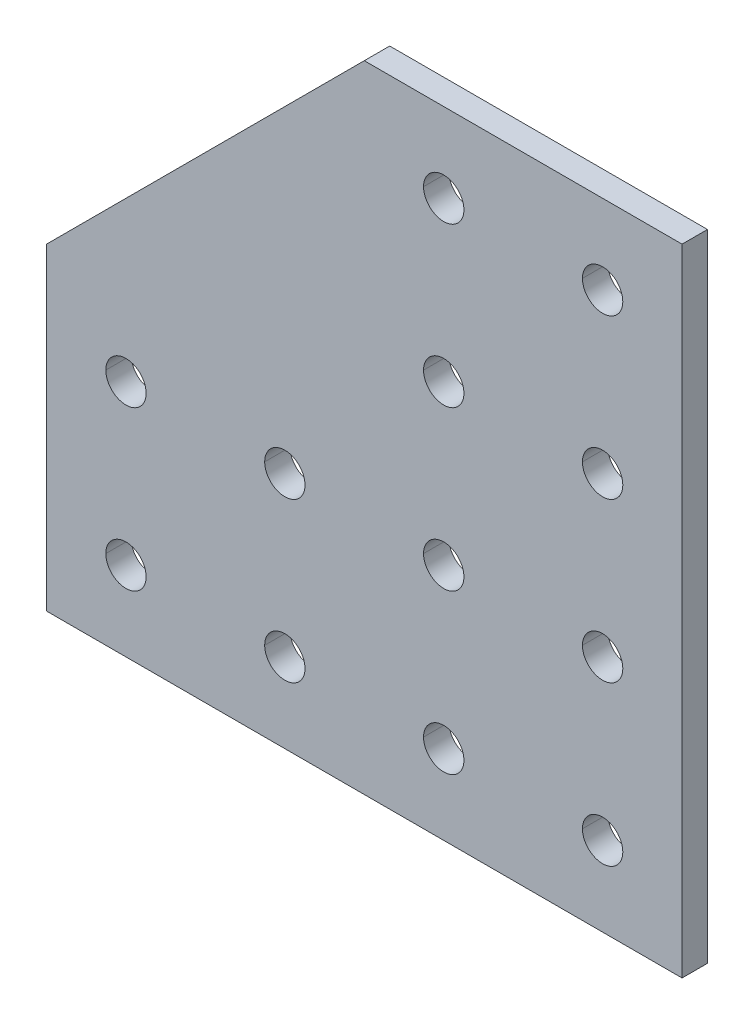
ISO-10303-21;
HEADER;
FILE_DESCRIPTION(('STEP AP214'),'2;1');
FILE_NAME('part.step','',(''),(''),'','','');
FILE_SCHEMA(('AUTOMOTIVE_DESIGN { 1 0 10303 214 1 1 1 1 }'));
ENDSEC;
DATA;
#1=APPLICATION_CONTEXT('core data for automotive mechanical design processes');
#2=APPLICATION_PROTOCOL_DEFINITION('international standard','automotive_design',2000,#1);
#3=PRODUCT_CONTEXT('',#1,'mechanical');
#4=PRODUCT('Part','Part','',(#3));
#5=PRODUCT_RELATED_PRODUCT_CATEGORY('part','',(#4));
#6=PRODUCT_DEFINITION_FORMATION('','',#4);
#7=PRODUCT_DEFINITION_CONTEXT('part definition',#1,'design');
#8=PRODUCT_DEFINITION('design','',#6,#7);
#9=PRODUCT_DEFINITION_SHAPE('','',#8);
#10=(LENGTH_UNIT() NAMED_UNIT(*) SI_UNIT(.MILLI.,.METRE.));
#11=(NAMED_UNIT(*) PLANE_ANGLE_UNIT() SI_UNIT($,.RADIAN.));
#12=(NAMED_UNIT(*) SI_UNIT($,.STERADIAN.) SOLID_ANGLE_UNIT());
#13=UNCERTAINTY_MEASURE_WITH_UNIT(LENGTH_MEASURE(1.E-05),#10,'distance_accuracy_value','');
#14=(GEOMETRIC_REPRESENTATION_CONTEXT(3) GLOBAL_UNCERTAINTY_ASSIGNED_CONTEXT((#13)) GLOBAL_UNIT_ASSIGNED_CONTEXT((#10,
#11,#12)) REPRESENTATION_CONTEXT('',''));
#15=CARTESIAN_POINT('',(0.,0.,0.));
#16=DIRECTION('',(0.,0.,1.));
#17=DIRECTION('',(1.,0.,0.));
#18=AXIS2_PLACEMENT_3D('',#15,#16,#17);
#19=CARTESIAN_POINT('',(50.,100.,4.));
#20=DIRECTION('',(0.,-1.,0.));
#21=DIRECTION('',(0.,0.,-1.));
#22=AXIS2_PLACEMENT_3D('',#19,#20,#21);
#23=PLANE('',#22);
#24=DIRECTION('',(-1.,0.,0.));
#25=VECTOR('',#24,1.);
#26=CARTESIAN_POINT('',(50.,100.,0.));
#27=LINE('',#26,#25);
#28=CARTESIAN_POINT('',(50.,100.,0.));
#29=VERTEX_POINT('',#28);
#30=CARTESIAN_POINT('',(0.,100.,0.));
#31=VERTEX_POINT('',#30);
#32=EDGE_CURVE('E11',#29,#31,#27,.T.);
#33=ORIENTED_EDGE('',*,*,#32,.T.);
#34=DIRECTION('',(0.,0.,-1.));
#35=VECTOR('',#34,1.);
#36=CARTESIAN_POINT('',(0.,100.,4.));
#37=LINE('',#36,#35);
#38=CARTESIAN_POINT('',(0.,100.,4.));
#39=VERTEX_POINT('',#38);
#40=EDGE_CURVE('E26',#39,#31,#37,.T.);
#41=ORIENTED_EDGE('',*,*,#40,.F.);
#42=DIRECTION('',(-1.,0.,0.));
#43=VECTOR('',#42,1.);
#44=CARTESIAN_POINT('',(50.,100.,4.));
#45=LINE('',#44,#43);
#46=CARTESIAN_POINT('',(50.,100.,4.));
#47=VERTEX_POINT('',#46);
#48=EDGE_CURVE('E501',#47,#39,#45,.T.);
#49=ORIENTED_EDGE('',*,*,#48,.F.);
#50=DIRECTION('',(0.,0.,-1.));
#51=VECTOR('',#50,1.);
#52=CARTESIAN_POINT('',(50.,100.,4.));
#53=LINE('',#52,#51);
#54=EDGE_CURVE('E497',#47,#29,#53,.T.);
#55=ORIENTED_EDGE('',*,*,#54,.T.);
#56=EDGE_LOOP('',(#33,#41,#49,#55));
#57=FACE_BOUND('',#56,.T.);
#58=ADVANCED_FACE('F18',(#57),#23,.F.);
#59=CARTESIAN_POINT('',(50.,0.,4.));
#60=DIRECTION('',(-1.,0.,0.));
#61=DIRECTION('',(0.,0.,1.));
#62=AXIS2_PLACEMENT_3D('',#59,#60,#61);
#63=PLANE('',#62);
#64=DIRECTION('',(0.,1.,0.));
#65=VECTOR('',#64,1.);
#66=CARTESIAN_POINT('',(50.,0.,0.));
#67=LINE('',#66,#65);
#68=CARTESIAN_POINT('',(50.,0.,0.));
#69=VERTEX_POINT('',#68);
#70=EDGE_CURVE('E492',#69,#29,#67,.T.);
#71=ORIENTED_EDGE('',*,*,#70,.T.);
#72=ORIENTED_EDGE('',*,*,#54,.F.);
#73=DIRECTION('',(0.,1.,0.));
#74=VECTOR('',#73,1.);
#75=CARTESIAN_POINT('',(50.,0.,4.));
#76=LINE('',#75,#74);
#77=CARTESIAN_POINT('',(50.,0.,4.));
#78=VERTEX_POINT('',#77);
#79=EDGE_CURVE('E487',#78,#47,#76,.T.);
#80=ORIENTED_EDGE('',*,*,#79,.F.);
#81=DIRECTION('',(0.,0.,-1.));
#82=VECTOR('',#81,1.);
#83=CARTESIAN_POINT('',(50.,0.,4.));
#84=LINE('',#83,#82);
#85=EDGE_CURVE('E483',#78,#69,#84,.T.);
#86=ORIENTED_EDGE('',*,*,#85,.T.);
#87=EDGE_LOOP('',(#71,#72,#80,#86));
#88=FACE_BOUND('',#87,.T.);
#89=ADVANCED_FACE('F525',(#88),#63,.F.);
#90=CARTESIAN_POINT('',(-50.,0.,4.));
#91=DIRECTION('',(0.,1.,0.));
#92=DIRECTION('',(0.,0.,1.));
#93=AXIS2_PLACEMENT_3D('',#90,#91,#92);
#94=PLANE('',#93);
#95=DIRECTION('',(1.,0.,0.));
#96=VECTOR('',#95,1.);
#97=CARTESIAN_POINT('',(-50.,0.,0.));
#98=LINE('',#97,#96);
#99=CARTESIAN_POINT('',(-50.,0.,0.));
#100=VERTEX_POINT('',#99);
#101=EDGE_CURVE('E478',#100,#69,#98,.T.);
#102=ORIENTED_EDGE('',*,*,#101,.T.);
#103=ORIENTED_EDGE('',*,*,#85,.F.);
#104=DIRECTION('',(1.,0.,0.));
#105=VECTOR('',#104,1.);
#106=CARTESIAN_POINT('',(-50.,0.,4.));
#107=LINE('',#106,#105);
#108=CARTESIAN_POINT('',(-50.,0.,4.));
#109=VERTEX_POINT('',#108);
#110=EDGE_CURVE('E473',#109,#78,#107,.T.);
#111=ORIENTED_EDGE('',*,*,#110,.F.);
#112=DIRECTION('',(0.,0.,-1.));
#113=VECTOR('',#112,1.);
#114=CARTESIAN_POINT('',(-50.,0.,4.));
#115=LINE('',#114,#113);
#116=EDGE_CURVE('E469',#109,#100,#115,.T.);
#117=ORIENTED_EDGE('',*,*,#116,.T.);
#118=EDGE_LOOP('',(#102,#103,#111,#117));
#119=FACE_BOUND('',#118,.T.);
#120=ADVANCED_FACE('F528',(#119),#94,.F.);
#121=CARTESIAN_POINT('',(-50.,50.,4.));
#122=DIRECTION('',(1.,0.,0.));
#123=DIRECTION('',(0.,0.,-1.));
#124=AXIS2_PLACEMENT_3D('',#121,#122,#123);
#125=PLANE('',#124);
#126=DIRECTION('',(0.,-1.,0.));
#127=VECTOR('',#126,1.);
#128=CARTESIAN_POINT('',(-50.,50.,0.));
#129=LINE('',#128,#127);
#130=CARTESIAN_POINT('',(-50.,50.,0.));
#131=VERTEX_POINT('',#130);
#132=EDGE_CURVE('E464',#131,#100,#129,.T.);
#133=ORIENTED_EDGE('',*,*,#132,.T.);
#134=ORIENTED_EDGE('',*,*,#116,.F.);
#135=DIRECTION('',(0.,-1.,0.));
#136=VECTOR('',#135,1.);
#137=CARTESIAN_POINT('',(-50.,50.,4.));
#138=LINE('',#137,#136);
#139=CARTESIAN_POINT('',(-50.,50.,4.));
#140=VERTEX_POINT('',#139);
#141=EDGE_CURVE('E459',#140,#109,#138,.T.);
#142=ORIENTED_EDGE('',*,*,#141,.F.);
#143=DIRECTION('',(0.,0.,-1.));
#144=VECTOR('',#143,1.);
#145=CARTESIAN_POINT('',(-50.,50.,4.));
#146=LINE('',#145,#144);
#147=EDGE_CURVE('E455',#140,#131,#146,.T.);
#148=ORIENTED_EDGE('',*,*,#147,.T.);
#149=EDGE_LOOP('',(#133,#134,#142,#148));
#150=FACE_BOUND('',#149,.T.);
#151=ADVANCED_FACE('F520',(#150),#125,.F.);
#152=CARTESIAN_POINT('',(0.,100.,4.));
#153=DIRECTION('',(0.707106781186548,-0.707106781186548,0.));
#154=DIRECTION('',(0.707106781186548,0.707106781186548,0.));
#155=AXIS2_PLACEMENT_3D('',#152,#153,#154);
#156=PLANE('',#155);
#157=DIRECTION('',(-0.707106781186548,-0.707106781186548,0.));
#158=VECTOR('',#157,1.);
#159=CARTESIAN_POINT('',(0.,100.,0.));
#160=LINE('',#159,#158);
#161=EDGE_CURVE('E450',#31,#131,#160,.T.);
#162=ORIENTED_EDGE('',*,*,#161,.T.);
#163=ORIENTED_EDGE('',*,*,#147,.F.);
#164=DIRECTION('',(-0.707106781186548,-0.707106781186548,0.));
#165=VECTOR('',#164,1.);
#166=CARTESIAN_POINT('',(0.,100.,4.));
#167=LINE('',#166,#165);
#168=EDGE_CURVE('E445',#39,#140,#167,.T.);
#169=ORIENTED_EDGE('',*,*,#168,.F.);
#170=ORIENTED_EDGE('',*,*,#40,.T.);
#171=EDGE_LOOP('',(#162,#163,#169,#170));
#172=FACE_BOUND('',#171,.T.);
#173=ADVANCED_FACE('F512',(#172),#156,.F.);
#174=CARTESIAN_POINT('',(0.,0.,4.));
#175=DIRECTION('',(0.,0.,1.));
#176=DIRECTION('',(1.,0.,0.));
#177=AXIS2_PLACEMENT_3D('',#174,#175,#176);
#178=PLANE('',#177);
#179=CARTESIAN_POINT('',(-37.5,37.5,4.));
#180=DIRECTION('',(0.,0.,1.));
#181=DIRECTION('',(1.,0.,0.));
#182=AXIS2_PLACEMENT_3D('',#179,#180,#181);
#183=CIRCLE('',#182,3.175);
#184=CARTESIAN_POINT('',(-34.325,37.5,4.));
#185=VERTEX_POINT('',#184);
#186=CARTESIAN_POINT('',(-40.675,37.5,4.));
#187=VERTEX_POINT('',#186);
#188=EDGE_CURVE('E440',#185,#187,#183,.T.);
#189=ORIENTED_EDGE('',*,*,#188,.F.);
#190=CARTESIAN_POINT('',(-37.5,37.5,4.));
#191=DIRECTION('',(0.,0.,1.));
#192=DIRECTION('',(1.,0.,0.));
#193=AXIS2_PLACEMENT_3D('',#190,#191,#192);
#194=CIRCLE('',#193,3.175);
#195=EDGE_CURVE('E435',#187,#185,#194,.T.);
#196=ORIENTED_EDGE('',*,*,#195,.F.);
#197=EDGE_LOOP('',(#189,#196));
#198=FACE_BOUND('',#197,.T.);
#199=CARTESIAN_POINT('',(-37.5,12.5,4.));
#200=DIRECTION('',(0.,0.,1.));
#201=DIRECTION('',(1.,0.,0.));
#202=AXIS2_PLACEMENT_3D('',#199,#200,#201);
#203=CIRCLE('',#202,3.175);
#204=CARTESIAN_POINT('',(-34.325,12.5,4.));
#205=VERTEX_POINT('',#204);
#206=CARTESIAN_POINT('',(-40.675,12.5,4.));
#207=VERTEX_POINT('',#206);
#208=EDGE_CURVE('E430',#205,#207,#203,.T.);
#209=ORIENTED_EDGE('',*,*,#208,.F.);
#210=CARTESIAN_POINT('',(-37.5,12.5,4.));
#211=DIRECTION('',(0.,0.,1.));
#212=DIRECTION('',(1.,0.,0.));
#213=AXIS2_PLACEMENT_3D('',#210,#211,#212);
#214=CIRCLE('',#213,3.175);
#215=EDGE_CURVE('E425',#207,#205,#214,.T.);
#216=ORIENTED_EDGE('',*,*,#215,.F.);
#217=EDGE_LOOP('',(#209,#216));
#218=FACE_BOUND('',#217,.T.);
#219=CARTESIAN_POINT('',(-12.5,37.5,4.));
#220=DIRECTION('',(0.,0.,1.));
#221=DIRECTION('',(1.,0.,0.));
#222=AXIS2_PLACEMENT_3D('',#219,#220,#221);
#223=CIRCLE('',#222,3.175);
#224=CARTESIAN_POINT('',(-9.325,37.5,4.));
#225=VERTEX_POINT('',#224);
#226=CARTESIAN_POINT('',(-15.675,37.5,4.));
#227=VERTEX_POINT('',#226);
#228=EDGE_CURVE('E420',#225,#227,#223,.T.);
#229=ORIENTED_EDGE('',*,*,#228,.F.);
#230=CARTESIAN_POINT('',(-12.5,37.5,4.));
#231=DIRECTION('',(0.,0.,1.));
#232=DIRECTION('',(1.,0.,0.));
#233=AXIS2_PLACEMENT_3D('',#230,#231,#232);
#234=CIRCLE('',#233,3.175);
#235=EDGE_CURVE('E415',#227,#225,#234,.T.);
#236=ORIENTED_EDGE('',*,*,#235,.F.);
#237=EDGE_LOOP('',(#229,#236));
#238=FACE_BOUND('',#237,.T.);
#239=CARTESIAN_POINT('',(-12.5,12.5,4.));
#240=DIRECTION('',(0.,0.,1.));
#241=DIRECTION('',(1.,0.,0.));
#242=AXIS2_PLACEMENT_3D('',#239,#240,#241);
#243=CIRCLE('',#242,3.175);
#244=CARTESIAN_POINT('',(-9.325,12.5,4.));
#245=VERTEX_POINT('',#244);
#246=CARTESIAN_POINT('',(-15.675,12.5,4.));
#247=VERTEX_POINT('',#246);
#248=EDGE_CURVE('E410',#245,#247,#243,.T.);
#249=ORIENTED_EDGE('',*,*,#248,.F.);
#250=CARTESIAN_POINT('',(-12.5,12.5,4.));
#251=DIRECTION('',(0.,0.,1.));
#252=DIRECTION('',(1.,0.,0.));
#253=AXIS2_PLACEMENT_3D('',#250,#251,#252);
#254=CIRCLE('',#253,3.175);
#255=EDGE_CURVE('E405',#247,#245,#254,.T.);
#256=ORIENTED_EDGE('',*,*,#255,.F.);
#257=EDGE_LOOP('',(#249,#256));
#258=FACE_BOUND('',#257,.T.);
#259=CARTESIAN_POINT('',(12.5,87.5,4.));
#260=DIRECTION('',(0.,0.,1.));
#261=DIRECTION('',(1.,0.,0.));
#262=AXIS2_PLACEMENT_3D('',#259,#260,#261);
#263=CIRCLE('',#262,3.175);
#264=CARTESIAN_POINT('',(15.675,87.5,4.));
#265=VERTEX_POINT('',#264);
#266=CARTESIAN_POINT('',(9.325,87.5,4.));
#267=VERTEX_POINT('',#266);
#268=EDGE_CURVE('E400',#265,#267,#263,.T.);
#269=ORIENTED_EDGE('',*,*,#268,.F.);
#270=CARTESIAN_POINT('',(12.5,87.5,4.));
#271=DIRECTION('',(0.,0.,1.));
#272=DIRECTION('',(1.,0.,0.));
#273=AXIS2_PLACEMENT_3D('',#270,#271,#272);
#274=CIRCLE('',#273,3.175);
#275=EDGE_CURVE('E395',#267,#265,#274,.T.);
#276=ORIENTED_EDGE('',*,*,#275,.F.);
#277=EDGE_LOOP('',(#269,#276));
#278=FACE_BOUND('',#277,.T.);
#279=CARTESIAN_POINT('',(12.5,62.5,4.));
#280=DIRECTION('',(0.,0.,1.));
#281=DIRECTION('',(1.,0.,0.));
#282=AXIS2_PLACEMENT_3D('',#279,#280,#281);
#283=CIRCLE('',#282,3.175);
#284=CARTESIAN_POINT('',(15.675,62.5,4.));
#285=VERTEX_POINT('',#284);
#286=CARTESIAN_POINT('',(9.325,62.5,4.));
#287=VERTEX_POINT('',#286);
#288=EDGE_CURVE('E390',#285,#287,#283,.T.);
#289=ORIENTED_EDGE('',*,*,#288,.F.);
#290=CARTESIAN_POINT('',(12.5,62.5,4.));
#291=DIRECTION('',(0.,0.,1.));
#292=DIRECTION('',(1.,0.,0.));
#293=AXIS2_PLACEMENT_3D('',#290,#291,#292);
#294=CIRCLE('',#293,3.175);
#295=EDGE_CURVE('E385',#287,#285,#294,.T.);
#296=ORIENTED_EDGE('',*,*,#295,.F.);
#297=EDGE_LOOP('',(#289,#296));
#298=FACE_BOUND('',#297,.T.);
#299=CARTESIAN_POINT('',(12.5,37.5,4.));
#300=DIRECTION('',(0.,0.,1.));
#301=DIRECTION('',(1.,0.,0.));
#302=AXIS2_PLACEMENT_3D('',#299,#300,#301);
#303=CIRCLE('',#302,3.175);
#304=CARTESIAN_POINT('',(15.675,37.5,4.));
#305=VERTEX_POINT('',#304);
#306=CARTESIAN_POINT('',(9.325,37.5,4.));
#307=VERTEX_POINT('',#306);
#308=EDGE_CURVE('E380',#305,#307,#303,.T.);
#309=ORIENTED_EDGE('',*,*,#308,.F.);
#310=CARTESIAN_POINT('',(12.5,37.5,4.));
#311=DIRECTION('',(0.,0.,1.));
#312=DIRECTION('',(1.,0.,0.));
#313=AXIS2_PLACEMENT_3D('',#310,#311,#312);
#314=CIRCLE('',#313,3.175);
#315=EDGE_CURVE('E375',#307,#305,#314,.T.);
#316=ORIENTED_EDGE('',*,*,#315,.F.);
#317=EDGE_LOOP('',(#309,#316));
#318=FACE_BOUND('',#317,.T.);
#319=CARTESIAN_POINT('',(12.5,12.5,4.));
#320=DIRECTION('',(0.,0.,1.));
#321=DIRECTION('',(1.,0.,0.));
#322=AXIS2_PLACEMENT_3D('',#319,#320,#321);
#323=CIRCLE('',#322,3.175);
#324=CARTESIAN_POINT('',(15.675,12.5,4.));
#325=VERTEX_POINT('',#324);
#326=CARTESIAN_POINT('',(9.325,12.5,4.));
#327=VERTEX_POINT('',#326);
#328=EDGE_CURVE('E370',#325,#327,#323,.T.);
#329=ORIENTED_EDGE('',*,*,#328,.F.);
#330=CARTESIAN_POINT('',(12.5,12.5,4.));
#331=DIRECTION('',(0.,0.,1.));
#332=DIRECTION('',(1.,0.,0.));
#333=AXIS2_PLACEMENT_3D('',#330,#331,#332);
#334=CIRCLE('',#333,3.175);
#335=EDGE_CURVE('E365',#327,#325,#334,.T.);
#336=ORIENTED_EDGE('',*,*,#335,.F.);
#337=EDGE_LOOP('',(#329,#336));
#338=FACE_BOUND('',#337,.T.);
#339=CARTESIAN_POINT('',(37.5,87.5,4.));
#340=DIRECTION('',(0.,0.,1.));
#341=DIRECTION('',(1.,0.,0.));
#342=AXIS2_PLACEMENT_3D('',#339,#340,#341);
#343=CIRCLE('',#342,3.175);
#344=CARTESIAN_POINT('',(40.675,87.5,4.));
#345=VERTEX_POINT('',#344);
#346=CARTESIAN_POINT('',(34.325,87.5,4.));
#347=VERTEX_POINT('',#346);
#348=EDGE_CURVE('E360',#345,#347,#343,.T.);
#349=ORIENTED_EDGE('',*,*,#348,.F.);
#350=CARTESIAN_POINT('',(37.5,87.5,4.));
#351=DIRECTION('',(0.,0.,1.));
#352=DIRECTION('',(1.,0.,0.));
#353=AXIS2_PLACEMENT_3D('',#350,#351,#352);
#354=CIRCLE('',#353,3.175);
#355=EDGE_CURVE('E355',#347,#345,#354,.T.);
#356=ORIENTED_EDGE('',*,*,#355,.F.);
#357=EDGE_LOOP('',(#349,#356));
#358=FACE_BOUND('',#357,.T.);
#359=CARTESIAN_POINT('',(37.5,62.5,4.));
#360=DIRECTION('',(0.,0.,1.));
#361=DIRECTION('',(1.,0.,0.));
#362=AXIS2_PLACEMENT_3D('',#359,#360,#361);
#363=CIRCLE('',#362,3.175);
#364=CARTESIAN_POINT('',(40.675,62.5,4.));
#365=VERTEX_POINT('',#364);
#366=CARTESIAN_POINT('',(34.325,62.5,4.));
#367=VERTEX_POINT('',#366);
#368=EDGE_CURVE('E350',#365,#367,#363,.T.);
#369=ORIENTED_EDGE('',*,*,#368,.F.);
#370=CARTESIAN_POINT('',(37.5,62.5,4.));
#371=DIRECTION('',(0.,0.,1.));
#372=DIRECTION('',(1.,0.,0.));
#373=AXIS2_PLACEMENT_3D('',#370,#371,#372);
#374=CIRCLE('',#373,3.175);
#375=EDGE_CURVE('E345',#367,#365,#374,.T.);
#376=ORIENTED_EDGE('',*,*,#375,.F.);
#377=EDGE_LOOP('',(#369,#376));
#378=FACE_BOUND('',#377,.T.);
#379=CARTESIAN_POINT('',(37.5,37.5,4.));
#380=DIRECTION('',(0.,0.,1.));
#381=DIRECTION('',(1.,0.,0.));
#382=AXIS2_PLACEMENT_3D('',#379,#380,#381);
#383=CIRCLE('',#382,3.175);
#384=CARTESIAN_POINT('',(40.675,37.5,4.));
#385=VERTEX_POINT('',#384);
#386=CARTESIAN_POINT('',(34.325,37.5,4.));
#387=VERTEX_POINT('',#386);
#388=EDGE_CURVE('E341',#385,#387,#383,.T.);
#389=ORIENTED_EDGE('',*,*,#388,.F.);
#390=CARTESIAN_POINT('',(37.5,37.5,4.));
#391=DIRECTION('',(0.,0.,1.));
#392=DIRECTION('',(1.,0.,0.));
#393=AXIS2_PLACEMENT_3D('',#390,#391,#392);
#394=CIRCLE('',#393,3.175);
#395=EDGE_CURVE('E218',#387,#385,#394,.T.);
#396=ORIENTED_EDGE('',*,*,#395,.F.);
#397=EDGE_LOOP('',(#389,#396));
#398=FACE_BOUND('',#397,.T.);
#399=CARTESIAN_POINT('',(37.5,12.5,4.));
#400=DIRECTION('',(0.,0.,1.));
#401=DIRECTION('',(1.,0.,0.));
#402=AXIS2_PLACEMENT_3D('',#399,#400,#401);
#403=CIRCLE('',#402,3.175);
#404=CARTESIAN_POINT('',(40.675,12.5,4.));
#405=VERTEX_POINT('',#404);
#406=CARTESIAN_POINT('',(34.325,12.5,4.));
#407=VERTEX_POINT('',#406);
#408=EDGE_CURVE('E333',#405,#407,#403,.T.);
#409=ORIENTED_EDGE('',*,*,#408,.F.);
#410=CARTESIAN_POINT('',(37.5,12.5,4.));
#411=DIRECTION('',(0.,0.,1.));
#412=DIRECTION('',(1.,0.,0.));
#413=AXIS2_PLACEMENT_3D('',#410,#411,#412);
#414=CIRCLE('',#413,3.175);
#415=EDGE_CURVE('E328',#407,#405,#414,.T.);
#416=ORIENTED_EDGE('',*,*,#415,.F.);
#417=EDGE_LOOP('',(#409,#416));
#418=FACE_BOUND('',#417,.T.);
#419=ORIENTED_EDGE('',*,*,#168,.T.);
#420=ORIENTED_EDGE('',*,*,#141,.T.);
#421=ORIENTED_EDGE('',*,*,#110,.T.);
#422=ORIENTED_EDGE('',*,*,#79,.T.);
#423=ORIENTED_EDGE('',*,*,#48,.T.);
#424=EDGE_LOOP('',(#419,#420,#421,#422,#423));
#425=FACE_BOUND('',#424,.T.);
#426=ADVANCED_FACE('F522',(#198,#218,#238,#258,#278,#298,#318,#338,#358,#378,#398,#418,#425),
#178,.T.);
#427=CARTESIAN_POINT('',(37.5,12.5,4.));
#428=DIRECTION('',(0.,0.,1.));
#429=DIRECTION('',(0.,1.,0.));
#430=AXIS2_PLACEMENT_3D('',#427,#428,#429);
#431=CYLINDRICAL_SURFACE('',#430,3.175);
#432=CARTESIAN_POINT('',(37.5,12.5,0.));
#433=DIRECTION('',(0.,0.,1.));
#434=DIRECTION('',(1.,0.,0.));
#435=AXIS2_PLACEMENT_3D('',#432,#433,#434);
#436=CIRCLE('',#435,3.175);
#437=CARTESIAN_POINT('',(34.325,12.5,0.));
#438=VERTEX_POINT('',#437);
#439=CARTESIAN_POINT('',(40.675,12.5,0.));
#440=VERTEX_POINT('',#439);
#441=EDGE_CURVE('E323',#438,#440,#436,.T.);
#442=ORIENTED_EDGE('',*,*,#441,.F.);
#443=DIRECTION('',(0.,0.,1.));
#444=VECTOR('',#443,1.);
#445=CARTESIAN_POINT('',(34.325,12.5,0.));
#446=LINE('',#445,#444);
#447=EDGE_CURVE('E318',#438,#407,#446,.T.);
#448=ORIENTED_EDGE('',*,*,#447,.T.);
#449=ORIENTED_EDGE('',*,*,#415,.T.);
#450=DIRECTION('',(0.,0.,1.));
#451=VECTOR('',#450,1.);
#452=CARTESIAN_POINT('',(40.675,12.5,0.));
#453=LINE('',#452,#451);
#454=EDGE_CURVE('E313',#440,#405,#453,.T.);
#455=ORIENTED_EDGE('',*,*,#454,.F.);
#456=EDGE_LOOP('',(#442,#448,#449,#455));
#457=FACE_BOUND('',#456,.T.);
#458=ADVANCED_FACE('F575',(#457),#431,.F.);
#459=CARTESIAN_POINT('',(37.5,12.5,4.));
#460=DIRECTION('',(0.,0.,1.));
#461=DIRECTION('',(0.,-1.,0.));
#462=AXIS2_PLACEMENT_3D('',#459,#460,#461);
#463=CYLINDRICAL_SURFACE('',#462,3.175);
#464=ORIENTED_EDGE('',*,*,#408,.T.);
#465=ORIENTED_EDGE('',*,*,#447,.F.);
#466=CARTESIAN_POINT('',(37.5,12.5,0.));
#467=DIRECTION('',(0.,0.,1.));
#468=DIRECTION('',(1.,0.,0.));
#469=AXIS2_PLACEMENT_3D('',#466,#467,#468);
#470=CIRCLE('',#469,3.175);
#471=EDGE_CURVE('E308',#440,#438,#470,.T.);
#472=ORIENTED_EDGE('',*,*,#471,.F.);
#473=ORIENTED_EDGE('',*,*,#454,.T.);
#474=EDGE_LOOP('',(#464,#465,#472,#473));
#475=FACE_BOUND('',#474,.T.);
#476=ADVANCED_FACE('F585',(#475),#463,.F.);
#477=CARTESIAN_POINT('',(0.,0.,0.));
#478=DIRECTION('',(0.,0.,1.));
#479=DIRECTION('',(1.,0.,0.));
#480=AXIS2_PLACEMENT_3D('',#477,#478,#479);
#481=PLANE('',#480);
#482=CARTESIAN_POINT('',(-37.5,37.5,0.));
#483=DIRECTION('',(0.,0.,1.));
#484=DIRECTION('',(1.,0.,0.));
#485=AXIS2_PLACEMENT_3D('',#482,#483,#484);
#486=CIRCLE('',#485,3.175);
#487=CARTESIAN_POINT('',(-34.325,37.5,0.));
#488=VERTEX_POINT('',#487);
#489=CARTESIAN_POINT('',(-40.675,37.5,0.));
#490=VERTEX_POINT('',#489);
#491=EDGE_CURVE('E304',#488,#490,#486,.T.);
#492=ORIENTED_EDGE('',*,*,#491,.T.);
#493=CARTESIAN_POINT('',(-37.5,37.5,0.));
#494=DIRECTION('',(0.,0.,1.));
#495=DIRECTION('',(1.,0.,0.));
#496=AXIS2_PLACEMENT_3D('',#493,#494,#495);
#497=CIRCLE('',#496,3.175);
#498=EDGE_CURVE('E300',#490,#488,#497,.T.);
#499=ORIENTED_EDGE('',*,*,#498,.T.);
#500=EDGE_LOOP('',(#492,#499));
#501=FACE_BOUND('',#500,.T.);
#502=CARTESIAN_POINT('',(-37.5,12.5,0.));
#503=DIRECTION('',(0.,0.,1.));
#504=DIRECTION('',(1.,0.,0.));
#505=AXIS2_PLACEMENT_3D('',#502,#503,#504);
#506=CIRCLE('',#505,3.175);
#507=CARTESIAN_POINT('',(-34.325,12.5,0.));
#508=VERTEX_POINT('',#507);
#509=CARTESIAN_POINT('',(-40.675,12.5,0.));
#510=VERTEX_POINT('',#509);
#511=EDGE_CURVE('E296',#508,#510,#506,.T.);
#512=ORIENTED_EDGE('',*,*,#511,.T.);
#513=CARTESIAN_POINT('',(-37.5,12.5,0.));
#514=DIRECTION('',(0.,0.,1.));
#515=DIRECTION('',(1.,0.,0.));
#516=AXIS2_PLACEMENT_3D('',#513,#514,#515);
#517=CIRCLE('',#516,3.175);
#518=EDGE_CURVE('E292',#510,#508,#517,.T.);
#519=ORIENTED_EDGE('',*,*,#518,.T.);
#520=EDGE_LOOP('',(#512,#519));
#521=FACE_BOUND('',#520,.T.);
#522=CARTESIAN_POINT('',(-12.5,37.5,0.));
#523=DIRECTION('',(0.,0.,1.));
#524=DIRECTION('',(1.,0.,0.));
#525=AXIS2_PLACEMENT_3D('',#522,#523,#524);
#526=CIRCLE('',#525,3.175);
#527=CARTESIAN_POINT('',(-9.325,37.5,0.));
#528=VERTEX_POINT('',#527);
#529=CARTESIAN_POINT('',(-15.675,37.5,0.));
#530=VERTEX_POINT('',#529);
#531=EDGE_CURVE('E288',#528,#530,#526,.T.);
#532=ORIENTED_EDGE('',*,*,#531,.T.);
#533=CARTESIAN_POINT('',(-12.5,37.5,0.));
#534=DIRECTION('',(0.,0.,1.));
#535=DIRECTION('',(1.,0.,0.));
#536=AXIS2_PLACEMENT_3D('',#533,#534,#535);
#537=CIRCLE('',#536,3.175);
#538=EDGE_CURVE('E284',#530,#528,#537,.T.);
#539=ORIENTED_EDGE('',*,*,#538,.T.);
#540=EDGE_LOOP('',(#532,#539));
#541=FACE_BOUND('',#540,.T.);
#542=CARTESIAN_POINT('',(-12.5,12.5,0.));
#543=DIRECTION('',(0.,0.,1.));
#544=DIRECTION('',(1.,0.,0.));
#545=AXIS2_PLACEMENT_3D('',#542,#543,#544);
#546=CIRCLE('',#545,3.175);
#547=CARTESIAN_POINT('',(-9.325,12.5,0.));
#548=VERTEX_POINT('',#547);
#549=CARTESIAN_POINT('',(-15.675,12.5,0.));
#550=VERTEX_POINT('',#549);
#551=EDGE_CURVE('E280',#548,#550,#546,.T.);
#552=ORIENTED_EDGE('',*,*,#551,.T.);
#553=CARTESIAN_POINT('',(-12.5,12.5,0.));
#554=DIRECTION('',(0.,0.,1.));
#555=DIRECTION('',(1.,0.,0.));
#556=AXIS2_PLACEMENT_3D('',#553,#554,#555);
#557=CIRCLE('',#556,3.175);
#558=EDGE_CURVE('E276',#550,#548,#557,.T.);
#559=ORIENTED_EDGE('',*,*,#558,.T.);
#560=EDGE_LOOP('',(#552,#559));
#561=FACE_BOUND('',#560,.T.);
#562=CARTESIAN_POINT('',(12.5,87.5,0.));
#563=DIRECTION('',(0.,0.,1.));
#564=DIRECTION('',(1.,0.,0.));
#565=AXIS2_PLACEMENT_3D('',#562,#563,#564);
#566=CIRCLE('',#565,3.175);
#567=CARTESIAN_POINT('',(15.675,87.5,0.));
#568=VERTEX_POINT('',#567);
#569=CARTESIAN_POINT('',(9.325,87.5,0.));
#570=VERTEX_POINT('',#569);
#571=EDGE_CURVE('E272',#568,#570,#566,.T.);
#572=ORIENTED_EDGE('',*,*,#571,.T.);
#573=CARTESIAN_POINT('',(12.5,87.5,0.));
#574=DIRECTION('',(0.,0.,1.));
#575=DIRECTION('',(1.,0.,0.));
#576=AXIS2_PLACEMENT_3D('',#573,#574,#575);
#577=CIRCLE('',#576,3.175);
#578=EDGE_CURVE('E268',#570,#568,#577,.T.);
#579=ORIENTED_EDGE('',*,*,#578,.T.);
#580=EDGE_LOOP('',(#572,#579));
#581=FACE_BOUND('',#580,.T.);
#582=CARTESIAN_POINT('',(12.5,62.5,0.));
#583=DIRECTION('',(0.,0.,1.));
#584=DIRECTION('',(1.,0.,0.));
#585=AXIS2_PLACEMENT_3D('',#582,#583,#584);
#586=CIRCLE('',#585,3.175);
#587=CARTESIAN_POINT('',(15.675,62.5,0.));
#588=VERTEX_POINT('',#587);
#589=CARTESIAN_POINT('',(9.325,62.5,0.));
#590=VERTEX_POINT('',#589);
#591=EDGE_CURVE('E264',#588,#590,#586,.T.);
#592=ORIENTED_EDGE('',*,*,#591,.T.);
#593=CARTESIAN_POINT('',(12.5,62.5,0.));
#594=DIRECTION('',(0.,0.,1.));
#595=DIRECTION('',(1.,0.,0.));
#596=AXIS2_PLACEMENT_3D('',#593,#594,#595);
#597=CIRCLE('',#596,3.175);
#598=EDGE_CURVE('E260',#590,#588,#597,.T.);
#599=ORIENTED_EDGE('',*,*,#598,.T.);
#600=EDGE_LOOP('',(#592,#599));
#601=FACE_BOUND('',#600,.T.);
#602=CARTESIAN_POINT('',(12.5,37.5,0.));
#603=DIRECTION('',(0.,0.,1.));
#604=DIRECTION('',(1.,0.,0.));
#605=AXIS2_PLACEMENT_3D('',#602,#603,#604);
#606=CIRCLE('',#605,3.175);
#607=CARTESIAN_POINT('',(15.675,37.5,0.));
#608=VERTEX_POINT('',#607);
#609=CARTESIAN_POINT('',(9.325,37.5,0.));
#610=VERTEX_POINT('',#609);
#611=EDGE_CURVE('E256',#608,#610,#606,.T.);
#612=ORIENTED_EDGE('',*,*,#611,.T.);
#613=CARTESIAN_POINT('',(12.5,37.5,0.));
#614=DIRECTION('',(0.,0.,1.));
#615=DIRECTION('',(1.,0.,0.));
#616=AXIS2_PLACEMENT_3D('',#613,#614,#615);
#617=CIRCLE('',#616,3.175);
#618=EDGE_CURVE('E252',#610,#608,#617,.T.);
#619=ORIENTED_EDGE('',*,*,#618,.T.);
#620=EDGE_LOOP('',(#612,#619));
#621=FACE_BOUND('',#620,.T.);
#622=CARTESIAN_POINT('',(12.5,12.5,0.));
#623=DIRECTION('',(0.,0.,1.));
#624=DIRECTION('',(1.,0.,0.));
#625=AXIS2_PLACEMENT_3D('',#622,#623,#624);
#626=CIRCLE('',#625,3.175);
#627=CARTESIAN_POINT('',(15.675,12.5,0.));
#628=VERTEX_POINT('',#627);
#629=CARTESIAN_POINT('',(9.325,12.5,0.));
#630=VERTEX_POINT('',#629);
#631=EDGE_CURVE('E248',#628,#630,#626,.T.);
#632=ORIENTED_EDGE('',*,*,#631,.T.);
#633=CARTESIAN_POINT('',(12.5,12.5,0.));
#634=DIRECTION('',(0.,0.,1.));
#635=DIRECTION('',(1.,0.,0.));
#636=AXIS2_PLACEMENT_3D('',#633,#634,#635);
#637=CIRCLE('',#636,3.175);
#638=EDGE_CURVE('E244',#630,#628,#637,.T.);
#639=ORIENTED_EDGE('',*,*,#638,.T.);
#640=EDGE_LOOP('',(#632,#639));
#641=FACE_BOUND('',#640,.T.);
#642=CARTESIAN_POINT('',(37.5,87.5,0.));
#643=DIRECTION('',(0.,0.,1.));
#644=DIRECTION('',(1.,0.,0.));
#645=AXIS2_PLACEMENT_3D('',#642,#643,#644);
#646=CIRCLE('',#645,3.175);
#647=CARTESIAN_POINT('',(40.675,87.5,0.));
#648=VERTEX_POINT('',#647);
#649=CARTESIAN_POINT('',(34.325,87.5,0.));
#650=VERTEX_POINT('',#649);
#651=EDGE_CURVE('E240',#648,#650,#646,.T.);
#652=ORIENTED_EDGE('',*,*,#651,.T.);
#653=CARTESIAN_POINT('',(37.5,87.5,0.));
#654=DIRECTION('',(0.,0.,1.));
#655=DIRECTION('',(1.,0.,0.));
#656=AXIS2_PLACEMENT_3D('',#653,#654,#655);
#657=CIRCLE('',#656,3.175);
#658=EDGE_CURVE('E236',#650,#648,#657,.T.);
#659=ORIENTED_EDGE('',*,*,#658,.T.);
#660=EDGE_LOOP('',(#652,#659));
#661=FACE_BOUND('',#660,.T.);
#662=CARTESIAN_POINT('',(37.5,62.5,0.));
#663=DIRECTION('',(0.,0.,1.));
#664=DIRECTION('',(1.,0.,0.));
#665=AXIS2_PLACEMENT_3D('',#662,#663,#664);
#666=CIRCLE('',#665,3.175);
#667=CARTESIAN_POINT('',(40.675,62.5,0.));
#668=VERTEX_POINT('',#667);
#669=CARTESIAN_POINT('',(34.325,62.5,0.));
#670=VERTEX_POINT('',#669);
#671=EDGE_CURVE('E226',#668,#670,#666,.T.);
#672=ORIENTED_EDGE('',*,*,#671,.T.);
#673=CARTESIAN_POINT('',(37.5,62.5,0.));
#674=DIRECTION('',(0.,0.,1.));
#675=DIRECTION('',(1.,0.,0.));
#676=AXIS2_PLACEMENT_3D('',#673,#674,#675);
#677=CIRCLE('',#676,3.175);
#678=EDGE_CURVE('E224',#670,#668,#677,.T.);
#679=ORIENTED_EDGE('',*,*,#678,.T.);
#680=EDGE_LOOP('',(#672,#679));
#681=FACE_BOUND('',#680,.T.);
#682=CARTESIAN_POINT('',(37.5,37.5,0.));
#683=DIRECTION('',(0.,0.,1.));
#684=DIRECTION('',(1.,0.,0.));
#685=AXIS2_PLACEMENT_3D('',#682,#683,#684);
#686=CIRCLE('',#685,3.175);
#687=CARTESIAN_POINT('',(40.675,37.5,0.));
#688=VERTEX_POINT('',#687);
#689=CARTESIAN_POINT('',(34.325,37.5,0.));
#690=VERTEX_POINT('',#689);
#691=EDGE_CURVE('E208',#688,#690,#686,.T.);
#692=ORIENTED_EDGE('',*,*,#691,.T.);
#693=CARTESIAN_POINT('',(37.5,37.5,0.));
#694=DIRECTION('',(0.,0.,1.));
#695=DIRECTION('',(1.,0.,0.));
#696=AXIS2_PLACEMENT_3D('',#693,#694,#695);
#697=CIRCLE('',#696,3.175);
#698=EDGE_CURVE('E203',#690,#688,#697,.T.);
#699=ORIENTED_EDGE('',*,*,#698,.T.);
#700=EDGE_LOOP('',(#692,#699));
#701=FACE_BOUND('',#700,.T.);
#702=ORIENTED_EDGE('',*,*,#471,.T.);
#703=ORIENTED_EDGE('',*,*,#441,.T.);
#704=EDGE_LOOP('',(#702,#703));
#705=FACE_BOUND('',#704,.T.);
#706=ORIENTED_EDGE('',*,*,#161,.F.);
#707=ORIENTED_EDGE('',*,*,#32,.F.);
#708=ORIENTED_EDGE('',*,*,#70,.F.);
#709=ORIENTED_EDGE('',*,*,#101,.F.);
#710=ORIENTED_EDGE('',*,*,#132,.F.);
#711=EDGE_LOOP('',(#706,#707,#708,#709,#710));
#712=FACE_BOUND('',#711,.T.);
#713=ADVANCED_FACE('F205',(#501,#521,#541,#561,#581,#601,#621,#641,#661,#681,#701,#705,#712),
#481,.F.);
#714=CARTESIAN_POINT('',(37.5,37.5,4.));
#715=DIRECTION('',(0.,0.,1.));
#716=DIRECTION('',(0.,1.,0.));
#717=AXIS2_PLACEMENT_3D('',#714,#715,#716);
#718=CYLINDRICAL_SURFACE('',#717,3.175);
#719=ORIENTED_EDGE('',*,*,#698,.F.);
#720=DIRECTION('',(0.,0.,1.));
#721=VECTOR('',#720,1.);
#722=CARTESIAN_POINT('',(34.325,37.5,0.));
#723=LINE('',#722,#721);
#724=EDGE_CURVE('E212',#690,#387,#723,.T.);
#725=ORIENTED_EDGE('',*,*,#724,.T.);
#726=ORIENTED_EDGE('',*,*,#395,.T.);
#727=DIRECTION('',(0.,0.,1.));
#728=VECTOR('',#727,1.);
#729=CARTESIAN_POINT('',(40.675,37.5,0.));
#730=LINE('',#729,#728);
#731=EDGE_CURVE('E216',#688,#385,#730,.T.);
#732=ORIENTED_EDGE('',*,*,#731,.F.);
#733=EDGE_LOOP('',(#719,#725,#726,#732));
#734=FACE_BOUND('',#733,.T.);
#735=ADVANCED_FACE('F217',(#734),#718,.F.);
#736=CARTESIAN_POINT('',(37.5,37.5,4.));
#737=DIRECTION('',(0.,0.,1.));
#738=DIRECTION('',(0.,-1.,0.));
#739=AXIS2_PLACEMENT_3D('',#736,#737,#738);
#740=CYLINDRICAL_SURFACE('',#739,3.175);
#741=ORIENTED_EDGE('',*,*,#388,.T.);
#742=ORIENTED_EDGE('',*,*,#724,.F.);
#743=ORIENTED_EDGE('',*,*,#691,.F.);
#744=ORIENTED_EDGE('',*,*,#731,.T.);
#745=EDGE_LOOP('',(#741,#742,#743,#744));
#746=FACE_BOUND('',#745,.T.);
#747=ADVANCED_FACE('F223',(#746),#740,.F.);
#748=CARTESIAN_POINT('',(37.5,62.5,4.));
#749=DIRECTION('',(0.,0.,1.));
#750=DIRECTION('',(0.,1.,0.));
#751=AXIS2_PLACEMENT_3D('',#748,#749,#750);
#752=CYLINDRICAL_SURFACE('',#751,3.175);
#753=ORIENTED_EDGE('',*,*,#678,.F.);
#754=DIRECTION('',(0.,0.,1.));
#755=VECTOR('',#754,1.);
#756=CARTESIAN_POINT('',(34.325,62.5,0.));
#757=LINE('',#756,#755);
#758=EDGE_CURVE('E221',#670,#367,#757,.T.);
#759=ORIENTED_EDGE('',*,*,#758,.T.);
#760=ORIENTED_EDGE('',*,*,#375,.T.);
#761=DIRECTION('',(0.,0.,1.));
#762=VECTOR('',#761,1.);
#763=CARTESIAN_POINT('',(40.675,62.5,0.));
#764=LINE('',#763,#762);
#765=EDGE_CURVE('E986',#668,#365,#764,.T.);
#766=ORIENTED_EDGE('',*,*,#765,.F.);
#767=EDGE_LOOP('',(#753,#759,#760,#766));
#768=FACE_BOUND('',#767,.T.);
#769=ADVANCED_FACE('F621',(#768),#752,.F.);
#770=CARTESIAN_POINT('',(37.5,62.5,4.));
#771=DIRECTION('',(0.,0.,1.));
#772=DIRECTION('',(0.,-1.,0.));
#773=AXIS2_PLACEMENT_3D('',#770,#771,#772);
#774=CYLINDRICAL_SURFACE('',#773,3.175);
#775=ORIENTED_EDGE('',*,*,#368,.T.);
#776=ORIENTED_EDGE('',*,*,#758,.F.);
#777=ORIENTED_EDGE('',*,*,#671,.F.);
#778=ORIENTED_EDGE('',*,*,#765,.T.);
#779=EDGE_LOOP('',(#775,#776,#777,#778));
#780=FACE_BOUND('',#779,.T.);
#781=ADVANCED_FACE('F630',(#780),#774,.F.);
#782=CARTESIAN_POINT('',(37.5,87.5,4.));
#783=DIRECTION('',(0.,0.,1.));
#784=DIRECTION('',(0.,1.,0.));
#785=AXIS2_PLACEMENT_3D('',#782,#783,#784);
#786=CYLINDRICAL_SURFACE('',#785,3.175);
#787=ORIENTED_EDGE('',*,*,#658,.F.);
#788=DIRECTION('',(0.,0.,1.));
#789=VECTOR('',#788,1.);
#790=CARTESIAN_POINT('',(34.325,87.5,0.));
#791=LINE('',#790,#789);
#792=EDGE_CURVE('E981',#650,#347,#791,.T.);
#793=ORIENTED_EDGE('',*,*,#792,.T.);
#794=ORIENTED_EDGE('',*,*,#355,.T.);
#795=DIRECTION('',(0.,0.,1.));
#796=VECTOR('',#795,1.);
#797=CARTESIAN_POINT('',(40.675,87.5,0.));
#798=LINE('',#797,#796);
#799=EDGE_CURVE('E976',#648,#345,#798,.T.);
#800=ORIENTED_EDGE('',*,*,#799,.F.);
#801=EDGE_LOOP('',(#787,#793,#794,#800));
#802=FACE_BOUND('',#801,.T.);
#803=ADVANCED_FACE('F640',(#802),#786,.F.);
#804=CARTESIAN_POINT('',(37.5,87.5,4.));
#805=DIRECTION('',(0.,0.,1.));
#806=DIRECTION('',(0.,-1.,0.));
#807=AXIS2_PLACEMENT_3D('',#804,#805,#806);
#808=CYLINDRICAL_SURFACE('',#807,3.175);
#809=ORIENTED_EDGE('',*,*,#348,.T.);
#810=ORIENTED_EDGE('',*,*,#792,.F.);
#811=ORIENTED_EDGE('',*,*,#651,.F.);
#812=ORIENTED_EDGE('',*,*,#799,.T.);
#813=EDGE_LOOP('',(#809,#810,#811,#812));
#814=FACE_BOUND('',#813,.T.);
#815=ADVANCED_FACE('F650',(#814),#808,.F.);
#816=CARTESIAN_POINT('',(12.5,12.5,4.));
#817=DIRECTION('',(0.,0.,1.));
#818=DIRECTION('',(0.,1.,0.));
#819=AXIS2_PLACEMENT_3D('',#816,#817,#818);
#820=CYLINDRICAL_SURFACE('',#819,3.175);
#821=ORIENTED_EDGE('',*,*,#638,.F.);
#822=DIRECTION('',(0.,0.,1.));
#823=VECTOR('',#822,1.);
#824=CARTESIAN_POINT('',(9.325,12.5,0.));
#825=LINE('',#824,#823);
#826=EDGE_CURVE('E971',#630,#327,#825,.T.);
#827=ORIENTED_EDGE('',*,*,#826,.T.);
#828=ORIENTED_EDGE('',*,*,#335,.T.);
#829=DIRECTION('',(0.,0.,1.));
#830=VECTOR('',#829,1.);
#831=CARTESIAN_POINT('',(15.675,12.5,0.));
#832=LINE('',#831,#830);
#833=EDGE_CURVE('E966',#628,#325,#832,.T.);
#834=ORIENTED_EDGE('',*,*,#833,.F.);
#835=EDGE_LOOP('',(#821,#827,#828,#834));
#836=FACE_BOUND('',#835,.T.);
#837=ADVANCED_FACE('F660',(#836),#820,.F.);
#838=CARTESIAN_POINT('',(12.5,12.5,4.));
#839=DIRECTION('',(0.,0.,1.));
#840=DIRECTION('',(0.,-1.,0.));
#841=AXIS2_PLACEMENT_3D('',#838,#839,#840);
#842=CYLINDRICAL_SURFACE('',#841,3.175);
#843=ORIENTED_EDGE('',*,*,#328,.T.);
#844=ORIENTED_EDGE('',*,*,#826,.F.);
#845=ORIENTED_EDGE('',*,*,#631,.F.);
#846=ORIENTED_EDGE('',*,*,#833,.T.);
#847=EDGE_LOOP('',(#843,#844,#845,#846));
#848=FACE_BOUND('',#847,.T.);
#849=ADVANCED_FACE('F670',(#848),#842,.F.);
#850=CARTESIAN_POINT('',(12.5,37.5,4.));
#851=DIRECTION('',(0.,0.,1.));
#852=DIRECTION('',(0.,1.,0.));
#853=AXIS2_PLACEMENT_3D('',#850,#851,#852);
#854=CYLINDRICAL_SURFACE('',#853,3.175);
#855=ORIENTED_EDGE('',*,*,#618,.F.);
#856=DIRECTION('',(0.,0.,1.));
#857=VECTOR('',#856,1.);
#858=CARTESIAN_POINT('',(9.325,37.5,0.));
#859=LINE('',#858,#857);
#860=EDGE_CURVE('E961',#610,#307,#859,.T.);
#861=ORIENTED_EDGE('',*,*,#860,.T.);
#862=ORIENTED_EDGE('',*,*,#315,.T.);
#863=DIRECTION('',(0.,0.,1.));
#864=VECTOR('',#863,1.);
#865=CARTESIAN_POINT('',(15.675,37.5,0.));
#866=LINE('',#865,#864);
#867=EDGE_CURVE('E956',#608,#305,#866,.T.);
#868=ORIENTED_EDGE('',*,*,#867,.F.);
#869=EDGE_LOOP('',(#855,#861,#862,#868));
#870=FACE_BOUND('',#869,.T.);
#871=ADVANCED_FACE('F680',(#870),#854,.F.);
#872=CARTESIAN_POINT('',(12.5,37.5,4.));
#873=DIRECTION('',(0.,0.,1.));
#874=DIRECTION('',(0.,-1.,0.));
#875=AXIS2_PLACEMENT_3D('',#872,#873,#874);
#876=CYLINDRICAL_SURFACE('',#875,3.175);
#877=ORIENTED_EDGE('',*,*,#308,.T.);
#878=ORIENTED_EDGE('',*,*,#860,.F.);
#879=ORIENTED_EDGE('',*,*,#611,.F.);
#880=ORIENTED_EDGE('',*,*,#867,.T.);
#881=EDGE_LOOP('',(#877,#878,#879,#880));
#882=FACE_BOUND('',#881,.T.);
#883=ADVANCED_FACE('F690',(#882),#876,.F.);
#884=CARTESIAN_POINT('',(12.5,62.5,4.));
#885=DIRECTION('',(0.,0.,1.));
#886=DIRECTION('',(0.,1.,0.));
#887=AXIS2_PLACEMENT_3D('',#884,#885,#886);
#888=CYLINDRICAL_SURFACE('',#887,3.175);
#889=ORIENTED_EDGE('',*,*,#598,.F.);
#890=DIRECTION('',(0.,0.,1.));
#891=VECTOR('',#890,1.);
#892=CARTESIAN_POINT('',(9.325,62.5,0.));
#893=LINE('',#892,#891);
#894=EDGE_CURVE('E951',#590,#287,#893,.T.);
#895=ORIENTED_EDGE('',*,*,#894,.T.);
#896=ORIENTED_EDGE('',*,*,#295,.T.);
#897=DIRECTION('',(0.,0.,1.));
#898=VECTOR('',#897,1.);
#899=CARTESIAN_POINT('',(15.675,62.5,0.));
#900=LINE('',#899,#898);
#901=EDGE_CURVE('E946',#588,#285,#900,.T.);
#902=ORIENTED_EDGE('',*,*,#901,.F.);
#903=EDGE_LOOP('',(#889,#895,#896,#902));
#904=FACE_BOUND('',#903,.T.);
#905=ADVANCED_FACE('F700',(#904),#888,.F.);
#906=CARTESIAN_POINT('',(12.5,62.5,4.));
#907=DIRECTION('',(0.,0.,1.));
#908=DIRECTION('',(0.,-1.,0.));
#909=AXIS2_PLACEMENT_3D('',#906,#907,#908);
#910=CYLINDRICAL_SURFACE('',#909,3.175);
#911=ORIENTED_EDGE('',*,*,#288,.T.);
#912=ORIENTED_EDGE('',*,*,#894,.F.);
#913=ORIENTED_EDGE('',*,*,#591,.F.);
#914=ORIENTED_EDGE('',*,*,#901,.T.);
#915=EDGE_LOOP('',(#911,#912,#913,#914));
#916=FACE_BOUND('',#915,.T.);
#917=ADVANCED_FACE('F710',(#916),#910,.F.);
#918=CARTESIAN_POINT('',(12.5,87.5,4.));
#919=DIRECTION('',(0.,0.,1.));
#920=DIRECTION('',(0.,1.,0.));
#921=AXIS2_PLACEMENT_3D('',#918,#919,#920);
#922=CYLINDRICAL_SURFACE('',#921,3.175);
#923=ORIENTED_EDGE('',*,*,#578,.F.);
#924=DIRECTION('',(0.,0.,1.));
#925=VECTOR('',#924,1.);
#926=CARTESIAN_POINT('',(9.325,87.5,0.));
#927=LINE('',#926,#925);
#928=EDGE_CURVE('E941',#570,#267,#927,.T.);
#929=ORIENTED_EDGE('',*,*,#928,.T.);
#930=ORIENTED_EDGE('',*,*,#275,.T.);
#931=DIRECTION('',(0.,0.,1.));
#932=VECTOR('',#931,1.);
#933=CARTESIAN_POINT('',(15.675,87.5,0.));
#934=LINE('',#933,#932);
#935=EDGE_CURVE('E936',#568,#265,#934,.T.);
#936=ORIENTED_EDGE('',*,*,#935,.F.);
#937=EDGE_LOOP('',(#923,#929,#930,#936));
#938=FACE_BOUND('',#937,.T.);
#939=ADVANCED_FACE('F720',(#938),#922,.F.);
#940=CARTESIAN_POINT('',(12.5,87.5,4.));
#941=DIRECTION('',(0.,0.,1.));
#942=DIRECTION('',(0.,-1.,0.));
#943=AXIS2_PLACEMENT_3D('',#940,#941,#942);
#944=CYLINDRICAL_SURFACE('',#943,3.175);
#945=ORIENTED_EDGE('',*,*,#268,.T.);
#946=ORIENTED_EDGE('',*,*,#928,.F.);
#947=ORIENTED_EDGE('',*,*,#571,.F.);
#948=ORIENTED_EDGE('',*,*,#935,.T.);
#949=EDGE_LOOP('',(#945,#946,#947,#948));
#950=FACE_BOUND('',#949,.T.);
#951=ADVANCED_FACE('F730',(#950),#944,.F.);
#952=CARTESIAN_POINT('',(-12.5,12.5,4.));
#953=DIRECTION('',(0.,0.,1.));
#954=DIRECTION('',(0.,1.,0.));
#955=AXIS2_PLACEMENT_3D('',#952,#953,#954);
#956=CYLINDRICAL_SURFACE('',#955,3.175);
#957=ORIENTED_EDGE('',*,*,#558,.F.);
#958=DIRECTION('',(0.,0.,1.));
#959=VECTOR('',#958,1.);
#960=CARTESIAN_POINT('',(-15.675,12.5,0.));
#961=LINE('',#960,#959);
#962=EDGE_CURVE('E931',#550,#247,#961,.T.);
#963=ORIENTED_EDGE('',*,*,#962,.T.);
#964=ORIENTED_EDGE('',*,*,#255,.T.);
#965=DIRECTION('',(0.,0.,1.));
#966=VECTOR('',#965,1.);
#967=CARTESIAN_POINT('',(-9.325,12.5,0.));
#968=LINE('',#967,#966);
#969=EDGE_CURVE('E926',#548,#245,#968,.T.);
#970=ORIENTED_EDGE('',*,*,#969,.F.);
#971=EDGE_LOOP('',(#957,#963,#964,#970));
#972=FACE_BOUND('',#971,.T.);
#973=ADVANCED_FACE('F740',(#972),#956,.F.);
#974=CARTESIAN_POINT('',(-12.5,12.5,4.));
#975=DIRECTION('',(0.,0.,1.));
#976=DIRECTION('',(0.,-1.,0.));
#977=AXIS2_PLACEMENT_3D('',#974,#975,#976);
#978=CYLINDRICAL_SURFACE('',#977,3.175);
#979=ORIENTED_EDGE('',*,*,#248,.T.);
#980=ORIENTED_EDGE('',*,*,#962,.F.);
#981=ORIENTED_EDGE('',*,*,#551,.F.);
#982=ORIENTED_EDGE('',*,*,#969,.T.);
#983=EDGE_LOOP('',(#979,#980,#981,#982));
#984=FACE_BOUND('',#983,.T.);
#985=ADVANCED_FACE('F750',(#984),#978,.F.);
#986=CARTESIAN_POINT('',(-12.5,37.5,4.));
#987=DIRECTION('',(0.,0.,1.));
#988=DIRECTION('',(0.,1.,0.));
#989=AXIS2_PLACEMENT_3D('',#986,#987,#988);
#990=CYLINDRICAL_SURFACE('',#989,3.175);
#991=ORIENTED_EDGE('',*,*,#538,.F.);
#992=DIRECTION('',(0.,0.,1.));
#993=VECTOR('',#992,1.);
#994=CARTESIAN_POINT('',(-15.675,37.5,0.));
#995=LINE('',#994,#993);
#996=EDGE_CURVE('E921',#530,#227,#995,.T.);
#997=ORIENTED_EDGE('',*,*,#996,.T.);
#998=ORIENTED_EDGE('',*,*,#235,.T.);
#999=DIRECTION('',(0.,0.,1.));
#1000=VECTOR('',#999,1.);
#1001=CARTESIAN_POINT('',(-9.325,37.5,0.));
#1002=LINE('',#1001,#1000);
#1003=EDGE_CURVE('E916',#528,#225,#1002,.T.);
#1004=ORIENTED_EDGE('',*,*,#1003,.F.);
#1005=EDGE_LOOP('',(#991,#997,#998,#1004));
#1006=FACE_BOUND('',#1005,.T.);
#1007=ADVANCED_FACE('F760',(#1006),#990,.F.);
#1008=CARTESIAN_POINT('',(-12.5,37.5,4.));
#1009=DIRECTION('',(0.,0.,1.));
#1010=DIRECTION('',(0.,-1.,0.));
#1011=AXIS2_PLACEMENT_3D('',#1008,#1009,#1010);
#1012=CYLINDRICAL_SURFACE('',#1011,3.175);
#1013=ORIENTED_EDGE('',*,*,#228,.T.);
#1014=ORIENTED_EDGE('',*,*,#996,.F.);
#1015=ORIENTED_EDGE('',*,*,#531,.F.);
#1016=ORIENTED_EDGE('',*,*,#1003,.T.);
#1017=EDGE_LOOP('',(#1013,#1014,#1015,#1016));
#1018=FACE_BOUND('',#1017,.T.);
#1019=ADVANCED_FACE('F770',(#1018),#1012,.F.);
#1020=CARTESIAN_POINT('',(-37.5,12.5,4.));
#1021=DIRECTION('',(0.,0.,1.));
#1022=DIRECTION('',(0.,1.,0.));
#1023=AXIS2_PLACEMENT_3D('',#1020,#1021,#1022);
#1024=CYLINDRICAL_SURFACE('',#1023,3.175);
#1025=ORIENTED_EDGE('',*,*,#518,.F.);
#1026=DIRECTION('',(0.,0.,1.));
#1027=VECTOR('',#1026,1.);
#1028=CARTESIAN_POINT('',(-40.675,12.5,0.));
#1029=LINE('',#1028,#1027);
#1030=EDGE_CURVE('E904',#510,#207,#1029,.T.);
#1031=ORIENTED_EDGE('',*,*,#1030,.T.);
#1032=ORIENTED_EDGE('',*,*,#215,.T.);
#1033=DIRECTION('',(0.,0.,1.));
#1034=VECTOR('',#1033,1.);
#1035=CARTESIAN_POINT('',(-34.325,12.5,0.));
#1036=LINE('',#1035,#1034);
#1037=EDGE_CURVE('E901',#508,#205,#1036,.T.);
#1038=ORIENTED_EDGE('',*,*,#1037,.F.);
#1039=EDGE_LOOP('',(#1025,#1031,#1032,#1038));
#1040=FACE_BOUND('',#1039,.T.);
#1041=ADVANCED_FACE('F780',(#1040),#1024,.F.);
#1042=CARTESIAN_POINT('',(-37.5,12.5,4.));
#1043=DIRECTION('',(0.,0.,1.));
#1044=DIRECTION('',(0.,-1.,0.));
#1045=AXIS2_PLACEMENT_3D('',#1042,#1043,#1044);
#1046=CYLINDRICAL_SURFACE('',#1045,3.175);
#1047=ORIENTED_EDGE('',*,*,#208,.T.);
#1048=ORIENTED_EDGE('',*,*,#1030,.F.);
#1049=ORIENTED_EDGE('',*,*,#511,.F.);
#1050=ORIENTED_EDGE('',*,*,#1037,.T.);
#1051=EDGE_LOOP('',(#1047,#1048,#1049,#1050));
#1052=FACE_BOUND('',#1051,.T.);
#1053=ADVANCED_FACE('F790',(#1052),#1046,.F.);
#1054=CARTESIAN_POINT('',(-37.5,37.5,4.));
#1055=DIRECTION('',(0.,0.,1.));
#1056=DIRECTION('',(0.,1.,0.));
#1057=AXIS2_PLACEMENT_3D('',#1054,#1055,#1056);
#1058=CYLINDRICAL_SURFACE('',#1057,3.175);
#1059=ORIENTED_EDGE('',*,*,#498,.F.);
#1060=DIRECTION('',(0.,0.,1.));
#1061=VECTOR('',#1060,1.);
#1062=CARTESIAN_POINT('',(-40.675,37.5,0.));
#1063=LINE('',#1062,#1061);
#1064=EDGE_CURVE('E896',#490,#187,#1063,.T.);
#1065=ORIENTED_EDGE('',*,*,#1064,.T.);
#1066=ORIENTED_EDGE('',*,*,#195,.T.);
#1067=DIRECTION('',(0.,0.,1.));
#1068=VECTOR('',#1067,1.);
#1069=CARTESIAN_POINT('',(-34.325,37.5,0.));
#1070=LINE('',#1069,#1068);
#1071=EDGE_CURVE('E898',#488,#185,#1070,.T.);
#1072=ORIENTED_EDGE('',*,*,#1071,.F.);
#1073=EDGE_LOOP('',(#1059,#1065,#1066,#1072));
#1074=FACE_BOUND('',#1073,.T.);
#1075=ADVANCED_FACE('F800',(#1074),#1058,.F.);
#1076=CARTESIAN_POINT('',(-37.5,37.5,4.));
#1077=DIRECTION('',(0.,0.,1.));
#1078=DIRECTION('',(0.,-1.,0.));
#1079=AXIS2_PLACEMENT_3D('',#1076,#1077,#1078);
#1080=CYLINDRICAL_SURFACE('',#1079,3.175);
#1081=ORIENTED_EDGE('',*,*,#188,.T.);
#1082=ORIENTED_EDGE('',*,*,#1064,.F.);
#1083=ORIENTED_EDGE('',*,*,#491,.F.);
#1084=ORIENTED_EDGE('',*,*,#1071,.T.);
#1085=EDGE_LOOP('',(#1081,#1082,#1083,#1084));
#1086=FACE_BOUND('',#1085,.T.);
#1087=ADVANCED_FACE('F809',(#1086),#1080,.F.);
#1088=CLOSED_SHELL('',(#58,#89,#120,#151,#173,#426,#458,#476,#713,#735,#747,#769,#781,#803,#815,
#837,#849,#871,#883,#905,#917,#939,#951,#973,#985,#1007,#1019,#1041,#1053,#1075,#1087));
#1089=MANIFOLD_SOLID_BREP('B1',#1088);
#1090=ADVANCED_BREP_SHAPE_REPRESENTATION('',(#18,#1089),#14);
#1091=SHAPE_DEFINITION_REPRESENTATION(#9,#1090);
ENDSEC;
END-ISO-10303-21;
